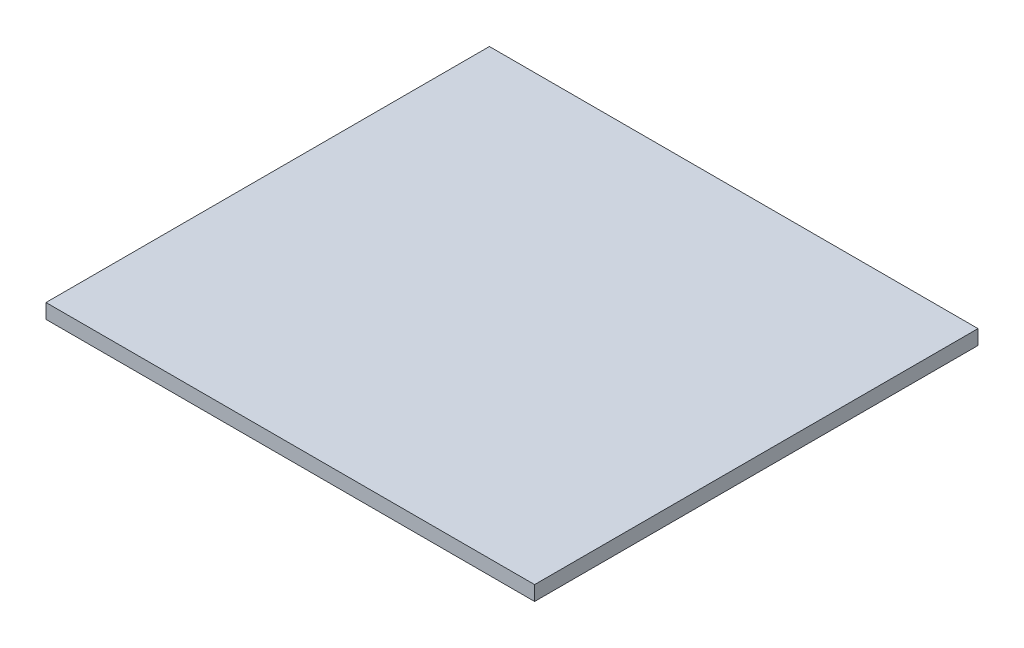
ISO-10303-21;
HEADER;
FILE_DESCRIPTION(('STEP AP214'),'2;1');
FILE_NAME('part.step','',(''),(''),'','','');
FILE_SCHEMA(('AUTOMOTIVE_DESIGN { 1 0 10303 214 1 1 1 1 }'));
ENDSEC;
DATA;
#1=APPLICATION_CONTEXT('core data for automotive mechanical design processes');
#2=APPLICATION_PROTOCOL_DEFINITION('international standard','automotive_design',2000,#1);
#3=PRODUCT_CONTEXT('',#1,'mechanical');
#4=PRODUCT('Part','Part','',(#3));
#5=PRODUCT_RELATED_PRODUCT_CATEGORY('part','',(#4));
#6=PRODUCT_DEFINITION_FORMATION('','',#4);
#7=PRODUCT_DEFINITION_CONTEXT('part definition',#1,'design');
#8=PRODUCT_DEFINITION('design','',#6,#7);
#9=PRODUCT_DEFINITION_SHAPE('','',#8);
#10=(LENGTH_UNIT() NAMED_UNIT(*) SI_UNIT(.MILLI.,.METRE.));
#11=(NAMED_UNIT(*) PLANE_ANGLE_UNIT() SI_UNIT($,.RADIAN.));
#12=(NAMED_UNIT(*) SI_UNIT($,.STERADIAN.) SOLID_ANGLE_UNIT());
#13=UNCERTAINTY_MEASURE_WITH_UNIT(LENGTH_MEASURE(1.E-05),#10,'distance_accuracy_value','');
#14=(GEOMETRIC_REPRESENTATION_CONTEXT(3) GLOBAL_UNCERTAINTY_ASSIGNED_CONTEXT((#13)) GLOBAL_UNIT_ASSIGNED_CONTEXT((#10,
#11,#12)) REPRESENTATION_CONTEXT('',''));
#15=CARTESIAN_POINT('',(0.,0.,0.));
#16=DIRECTION('',(0.,0.,1.));
#17=DIRECTION('',(1.,0.,0.));
#18=AXIS2_PLACEMENT_3D('',#15,#16,#17);
#19=CARTESIAN_POINT('',(-222.694166959585,12.,-98.6348122866894));
#20=DIRECTION('',(1.,0.,0.));
#21=DIRECTION('',(0.,0.,-1.));
#22=AXIS2_PLACEMENT_3D('',#19,#20,#21);
#23=PLANE('',#22);
#24=DIRECTION('',(0.,0.,1.));
#25=VECTOR('',#24,1.);
#26=CARTESIAN_POINT('',(-222.694166959585,0.,-98.6348122866894));
#27=LINE('',#26,#25);
#28=CARTESIAN_POINT('',(-222.694166959585,0.,-98.6348122866894));
#29=VERTEX_POINT('',#28);
#30=CARTESIAN_POINT('',(-222.694166959585,0.,264.365187713311));
#31=VERTEX_POINT('',#30);
#32=EDGE_CURVE('E96',#29,#31,#27,.T.);
#33=ORIENTED_EDGE('',*,*,#32,.T.);
#34=DIRECTION('',(0.,-1.,0.));
#35=VECTOR('',#34,1.);
#36=CARTESIAN_POINT('',(-222.694166959585,12.,264.365187713311));
#37=LINE('',#36,#35);
#38=CARTESIAN_POINT('',(-222.694166959585,12.,264.365187713311));
#39=VERTEX_POINT('',#38);
#40=EDGE_CURVE('E11',#39,#31,#37,.T.);
#41=ORIENTED_EDGE('',*,*,#40,.F.);
#42=DIRECTION('',(0.,0.,1.));
#43=VECTOR('',#42,1.);
#44=CARTESIAN_POINT('',(-222.694166959585,12.,-98.6348122866894));
#45=LINE('',#44,#43);
#46=CARTESIAN_POINT('',(-222.694166959585,12.,-98.6348122866894));
#47=VERTEX_POINT('',#46);
#48=EDGE_CURVE('E84',#47,#39,#45,.T.);
#49=ORIENTED_EDGE('',*,*,#48,.F.);
#50=DIRECTION('',(0.,-1.,0.));
#51=VECTOR('',#50,1.);
#52=CARTESIAN_POINT('',(-222.694166959585,12.,-98.6348122866894));
#53=LINE('',#52,#51);
#54=EDGE_CURVE('E92',#47,#29,#53,.T.);
#55=ORIENTED_EDGE('',*,*,#54,.T.);
#56=EDGE_LOOP('',(#33,#41,#49,#55));
#57=FACE_BOUND('',#56,.T.);
#58=ADVANCED_FACE('F33',(#57),#23,.F.);
#59=CARTESIAN_POINT('',(-222.694166959585,12.,264.365187713311));
#60=DIRECTION('',(0.,0.,-1.));
#61=DIRECTION('',(-1.,0.,0.));
#62=AXIS2_PLACEMENT_3D('',#59,#60,#61);
#63=PLANE('',#62);
#64=DIRECTION('',(1.,0.,0.));
#65=VECTOR('',#64,1.);
#66=CARTESIAN_POINT('',(-222.694166959585,0.,264.365187713311));
#67=LINE('',#66,#65);
#68=CARTESIAN_POINT('',(177.305833040415,0.,264.365187713311));
#69=VERTEX_POINT('',#68);
#70=EDGE_CURVE('E88',#31,#69,#67,.T.);
#71=ORIENTED_EDGE('',*,*,#70,.T.);
#72=DIRECTION('',(0.,-1.,0.));
#73=VECTOR('',#72,1.);
#74=CARTESIAN_POINT('',(177.305833040415,12.,264.365187713311));
#75=LINE('',#74,#73);
#76=CARTESIAN_POINT('',(177.305833040415,12.,264.365187713311));
#77=VERTEX_POINT('',#76);
#78=EDGE_CURVE('E41',#77,#69,#75,.T.);
#79=ORIENTED_EDGE('',*,*,#78,.F.);
#80=DIRECTION('',(1.,0.,0.));
#81=VECTOR('',#80,1.);
#82=CARTESIAN_POINT('',(-222.694166959585,12.,264.365187713311));
#83=LINE('',#82,#81);
#84=EDGE_CURVE('E79',#39,#77,#83,.T.);
#85=ORIENTED_EDGE('',*,*,#84,.F.);
#86=ORIENTED_EDGE('',*,*,#40,.T.);
#87=EDGE_LOOP('',(#71,#79,#85,#86));
#88=FACE_BOUND('',#87,.T.);
#89=ADVANCED_FACE('F87',(#88),#63,.F.);
#90=CARTESIAN_POINT('',(177.305833040415,12.,-98.6348122866894));
#91=DIRECTION('',(-1.,0.,0.));
#92=DIRECTION('',(0.,0.,1.));
#93=AXIS2_PLACEMENT_3D('',#90,#91,#92);
#94=PLANE('',#93);
#95=DIRECTION('',(0.,0.,-1.));
#96=VECTOR('',#95,1.);
#97=CARTESIAN_POINT('',(177.305833040415,0.,-98.6348122866894));
#98=LINE('',#97,#96);
#99=CARTESIAN_POINT('',(177.305833040415,0.,-98.6348122866894));
#100=VERTEX_POINT('',#99);
#101=EDGE_CURVE('E66',#69,#100,#98,.T.);
#102=ORIENTED_EDGE('',*,*,#101,.T.);
#103=DIRECTION('',(0.,-1.,0.));
#104=VECTOR('',#103,1.);
#105=CARTESIAN_POINT('',(177.305833040415,12.,-98.6348122866894));
#106=LINE('',#105,#104);
#107=CARTESIAN_POINT('',(177.305833040415,12.,-98.6348122866894));
#108=VERTEX_POINT('',#107);
#109=EDGE_CURVE('E89',#108,#100,#106,.T.);
#110=ORIENTED_EDGE('',*,*,#109,.F.);
#111=DIRECTION('',(0.,0.,-1.));
#112=VECTOR('',#111,1.);
#113=CARTESIAN_POINT('',(177.305833040415,12.,-98.6348122866894));
#114=LINE('',#113,#112);
#115=EDGE_CURVE('E82',#77,#108,#114,.T.);
#116=ORIENTED_EDGE('',*,*,#115,.F.);
#117=ORIENTED_EDGE('',*,*,#78,.T.);
#118=EDGE_LOOP('',(#102,#110,#116,#117));
#119=FACE_BOUND('',#118,.T.);
#120=ADVANCED_FACE('F90',(#119),#94,.F.);
#121=CARTESIAN_POINT('',(-222.694166959585,12.,-98.6348122866894));
#122=DIRECTION('',(0.,0.,1.));
#123=DIRECTION('',(1.,0.,0.));
#124=AXIS2_PLACEMENT_3D('',#121,#122,#123);
#125=PLANE('',#124);
#126=DIRECTION('',(-1.,0.,0.));
#127=VECTOR('',#126,1.);
#128=CARTESIAN_POINT('',(-222.694166959585,0.,-98.6348122866894));
#129=LINE('',#128,#127);
#130=EDGE_CURVE('E72',#100,#29,#129,.T.);
#131=ORIENTED_EDGE('',*,*,#130,.T.);
#132=ORIENTED_EDGE('',*,*,#54,.F.);
#133=DIRECTION('',(-1.,0.,0.));
#134=VECTOR('',#133,1.);
#135=CARTESIAN_POINT('',(-222.694166959585,12.,-98.6348122866894));
#136=LINE('',#135,#134);
#137=EDGE_CURVE('E49',#108,#47,#136,.T.);
#138=ORIENTED_EDGE('',*,*,#137,.F.);
#139=ORIENTED_EDGE('',*,*,#109,.T.);
#140=EDGE_LOOP('',(#131,#132,#138,#139));
#141=FACE_BOUND('',#140,.T.);
#142=ADVANCED_FACE('F103',(#141),#125,.F.);
#143=CARTESIAN_POINT('',(0.,12.,0.));
#144=DIRECTION('',(0.,1.,0.));
#145=DIRECTION('',(0.,0.,1.));
#146=AXIS2_PLACEMENT_3D('',#143,#144,#145);
#147=PLANE('',#146);
#148=ORIENTED_EDGE('',*,*,#48,.T.);
#149=ORIENTED_EDGE('',*,*,#84,.T.);
#150=ORIENTED_EDGE('',*,*,#115,.T.);
#151=ORIENTED_EDGE('',*,*,#137,.T.);
#152=EDGE_LOOP('',(#148,#149,#150,#151));
#153=FACE_BOUND('',#152,.T.);
#154=ADVANCED_FACE('F80',(#153),#147,.T.);
#155=CARTESIAN_POINT('',(0.,0.,0.));
#156=DIRECTION('',(0.,1.,0.));
#157=DIRECTION('',(0.,0.,1.));
#158=AXIS2_PLACEMENT_3D('',#155,#156,#157);
#159=PLANE('',#158);
#160=ORIENTED_EDGE('',*,*,#32,.F.);
#161=ORIENTED_EDGE('',*,*,#130,.F.);
#162=ORIENTED_EDGE('',*,*,#101,.F.);
#163=ORIENTED_EDGE('',*,*,#70,.F.);
#164=EDGE_LOOP('',(#160,#161,#162,#163));
#165=FACE_BOUND('',#164,.T.);
#166=ADVANCED_FACE('F106',(#165),#159,.F.);
#167=CLOSED_SHELL('',(#58,#89,#120,#142,#154,#166));
#168=MANIFOLD_SOLID_BREP('B2',#167);
#169=ADVANCED_BREP_SHAPE_REPRESENTATION('',(#18,#168),#14);
#170=SHAPE_DEFINITION_REPRESENTATION(#9,#169);
ENDSEC;
END-ISO-10303-21;
